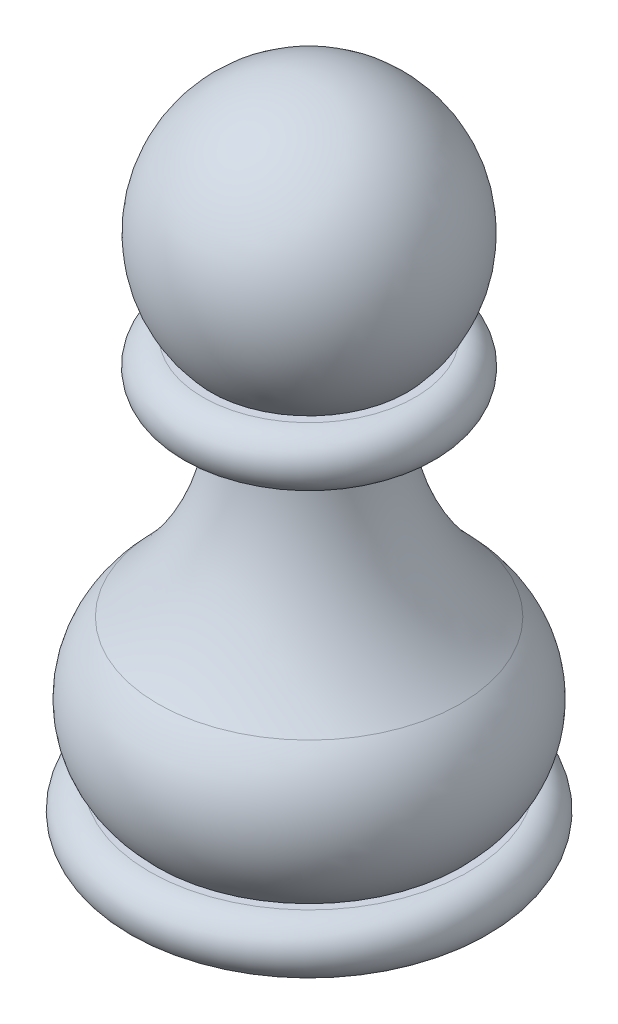
ISO-10303-21;
HEADER;
FILE_DESCRIPTION(('STEP AP214'),'2;1');
FILE_NAME('part.step','',(''),(''),'','','');
FILE_SCHEMA(('AUTOMOTIVE_DESIGN { 1 0 10303 214 1 1 1 1 }'));
ENDSEC;
DATA;
#1=APPLICATION_CONTEXT('core data for automotive mechanical design processes');
#2=APPLICATION_PROTOCOL_DEFINITION('international standard','automotive_design',2000,#1);
#3=PRODUCT_CONTEXT('',#1,'mechanical');
#4=PRODUCT('Part','Part','',(#3));
#5=PRODUCT_RELATED_PRODUCT_CATEGORY('part','',(#4));
#6=PRODUCT_DEFINITION_FORMATION('','',#4);
#7=PRODUCT_DEFINITION_CONTEXT('part definition',#1,'design');
#8=PRODUCT_DEFINITION('design','',#6,#7);
#9=PRODUCT_DEFINITION_SHAPE('','',#8);
#10=(LENGTH_UNIT() NAMED_UNIT(*) SI_UNIT(.MILLI.,.METRE.));
#11=(NAMED_UNIT(*) PLANE_ANGLE_UNIT() SI_UNIT($,.RADIAN.));
#12=(NAMED_UNIT(*) SI_UNIT($,.STERADIAN.) SOLID_ANGLE_UNIT());
#13=UNCERTAINTY_MEASURE_WITH_UNIT(LENGTH_MEASURE(1.E-05),#10,'distance_accuracy_value','');
#14=(GEOMETRIC_REPRESENTATION_CONTEXT(3) GLOBAL_UNCERTAINTY_ASSIGNED_CONTEXT((#13)) GLOBAL_UNIT_ASSIGNED_CONTEXT((#10,
#11,#12)) REPRESENTATION_CONTEXT('',''));
#15=CARTESIAN_POINT('',(0.,0.,0.));
#16=DIRECTION('',(0.,0.,1.));
#17=DIRECTION('',(1.,0.,0.));
#18=AXIS2_PLACEMENT_3D('',#15,#16,#17);
#19=CARTESIAN_POINT('',(0.,-127.184439834025,0.));
#20=DIRECTION('',(0.,-1.,0.));
#21=DIRECTION('',(0.,0.,-1.));
#22=AXIS2_PLACEMENT_3D('',#19,#20,#21);
#23=PLANE('',#22);
#24=CARTESIAN_POINT('',(43.3960580912863,-127.184439834025,0.));
#25=DIRECTION('',(0.,1.,0.));
#26=DIRECTION('',(0.,0.,1.));
#27=AXIS2_PLACEMENT_3D('',#24,#25,#26);
#28=CIRCLE('',#27,229.385689951311);
#29=CARTESIAN_POINT('',(43.3960580912863,-127.184439834025,229.385689951311));
#30=VERTEX_POINT('',#29);
#31=EDGE_CURVE('E11',#30,#30,#28,.T.);
#32=ORIENTED_EDGE('',*,*,#31,.T.);
#33=EDGE_LOOP('',(#32));
#34=FACE_BOUND('',#33,.T.);
#35=ADVANCED_FACE('F52',(#34),#23,.F.);
#36=CARTESIAN_POINT('',(43.3960580912862,-165.284439834025,0.));
#37=DIRECTION('',(0.,1.,0.));
#38=DIRECTION('',(0.,0.,1.));
#39=AXIS2_PLACEMENT_3D('',#36,#37,#38);
#40=TOROIDAL_SURFACE('',#39,229.385689951311,38.1);
#41=CARTESIAN_POINT('',(43.3960580912863,-203.384439834025,0.));
#42=DIRECTION('',(0.,1.,0.));
#43=DIRECTION('',(0.,0.,1.));
#44=AXIS2_PLACEMENT_3D('',#41,#42,#43);
#45=CIRCLE('',#44,229.385689951311);
#46=CARTESIAN_POINT('',(43.3960580912863,-203.384439834025,229.385689951311));
#47=VERTEX_POINT('',#46);
#48=EDGE_CURVE('E58',#47,#47,#45,.T.);
#49=ORIENTED_EDGE('',*,*,#48,.T.);
#50=EDGE_LOOP('',(#49));
#51=FACE_BOUND('',#50,.T.);
#52=ORIENTED_EDGE('',*,*,#31,.F.);
#53=EDGE_LOOP('',(#52));
#54=FACE_BOUND('',#53,.T.);
#55=ADVANCED_FACE('F64',(#51,#54),#40,.T.);
#56=CARTESIAN_POINT('',(0.,-203.384439834025,0.));
#57=DIRECTION('',(0.,-1.,0.));
#58=DIRECTION('',(0.,0.,-1.));
#59=AXIS2_PLACEMENT_3D('',#56,#57,#58);
#60=PLANE('',#59);
#61=ORIENTED_EDGE('',*,*,#48,.F.);
#62=EDGE_LOOP('',(#61));
#63=FACE_BOUND('',#62,.T.);
#64=ADVANCED_FACE('F67',(#63),#60,.T.);
#65=CLOSED_SHELL('',(#35,#55,#64));
#66=MANIFOLD_SOLID_BREP('B2',#65);
#67=CARTESIAN_POINT('',(43.3960580912863,76.0155601659751,0.));
#68=DIRECTION('',(0.,-1.,0.));
#69=DIRECTION('',(0.,0.,-1.));
#70=AXIS2_PLACEMENT_3D('',#67,#68,#69);
#71=CONICAL_SURFACE('',#70,217.474407401017,0.0041964545516721);
#72=CARTESIAN_POINT('',(43.3960580912863,-127.184439834025,0.));
#73=DIRECTION('',(0.,1.,0.));
#74=DIRECTION('',(0.,0.,1.));
#75=AXIS2_PLACEMENT_3D('',#72,#73,#74);
#76=CIRCLE('',#75,218.327131971482);
#77=CARTESIAN_POINT('',(43.3960580912863,-127.184439834025,218.327131971482));
#78=VERTEX_POINT('',#77);
#79=EDGE_CURVE('E112',#78,#78,#76,.T.);
#80=ORIENTED_EDGE('',*,*,#79,.F.);
#81=EDGE_LOOP('',(#80));
#82=FACE_BOUND('',#81,.T.);
#83=CARTESIAN_POINT('',(43.3960580912863,76.0155601659751,0.));
#84=DIRECTION('',(0.,1.,0.));
#85=DIRECTION('',(0.,0.,1.));
#86=AXIS2_PLACEMENT_3D('',#83,#84,#85);
#87=CIRCLE('',#86,217.474407401017);
#88=CARTESIAN_POINT('',(43.3960580912863,76.0155601659751,217.474407401017));
#89=VERTEX_POINT('',#88);
#90=EDGE_CURVE('E51',#89,#89,#87,.T.);
#91=ORIENTED_EDGE('',*,*,#90,.T.);
#92=EDGE_LOOP('',(#91));
#93=FACE_BOUND('',#92,.T.);
#94=ADVANCED_FACE('F106',(#82,#93),#71,.F.);
#95=CARTESIAN_POINT('',(43.3960580912863,-26.0010449192238,0.));
#96=DIRECTION('',(0.,1.,0.));
#97=DIRECTION('',(0.,0.,1.));
#98=AXIS2_PLACEMENT_3D('',#95,#96,#97);
#99=DEGENERATE_TOROIDAL_SURFACE('',#98,118.625861650825,142.050775112413,.T.);
#100=ORIENTED_EDGE('',*,*,#79,.T.);
#101=EDGE_LOOP('',(#100));
#102=FACE_BOUND('',#101,.T.);
#103=ORIENTED_EDGE('',*,*,#90,.F.);
#104=EDGE_LOOP('',(#103));
#105=FACE_BOUND('',#104,.T.);
#106=ADVANCED_FACE('F118',(#102,#105),#99,.T.);
#107=CLOSED_SHELL('',(#94,#106));
#108=MANIFOLD_SOLID_BREP('B6',#107);
#109=CARTESIAN_POINT('',(0.,425.838329958692,0.));
#110=DIRECTION('',(0.,-1.,0.));
#111=DIRECTION('',(0.,0.,-1.));
#112=AXIS2_PLACEMENT_3D('',#109,#110,#111);
#113=PLANE('',#112);
#114=CARTESIAN_POINT('',(43.3960580912863,425.838329958692,0.));
#115=DIRECTION('',(0.,-1.,0.));
#116=DIRECTION('',(0.,0.,-1.));
#117=AXIS2_PLACEMENT_3D('',#114,#115,#116);
#118=CIRCLE('',#117,140.862582645731);
#119=CARTESIAN_POINT('',(43.3960580912863,425.838329958692,-140.862582645731));
#120=VERTEX_POINT('',#119);
#121=EDGE_CURVE('E105',#120,#120,#118,.F.);
#122=ORIENTED_EDGE('',*,*,#121,.F.);
#123=EDGE_LOOP('',(#122));
#124=FACE_BOUND('',#123,.T.);
#125=CARTESIAN_POINT('',(43.3960580912863,425.838329958692,0.));
#126=DIRECTION('',(0.,1.,0.));
#127=DIRECTION('',(0.,0.,1.));
#128=AXIS2_PLACEMENT_3D('',#125,#126,#127);
#129=CIRCLE('',#128,152.811025060079);
#130=CARTESIAN_POINT('',(43.3960580912863,425.838329958692,152.811025060079));
#131=VERTEX_POINT('',#130);
#132=EDGE_CURVE('E150',#131,#131,#129,.T.);
#133=ORIENTED_EDGE('',*,*,#132,.T.);
#134=EDGE_LOOP('',(#133));
#135=FACE_BOUND('',#134,.T.);
#136=ADVANCED_FACE('F142',(#124,#135),#113,.F.);
#137=CARTESIAN_POINT('',(43.3960580912863,387.738329958692,0.));
#138=DIRECTION('',(0.,1.,0.));
#139=DIRECTION('',(0.,0.,1.));
#140=AXIS2_PLACEMENT_3D('',#137,#138,#139);
#141=TOROIDAL_SURFACE('',#140,152.811025060079,38.1);
#142=CARTESIAN_POINT('',(43.3960580912863,349.638329958692,0.));
#143=DIRECTION('',(0.,1.,0.));
#144=DIRECTION('',(0.,0.,1.));
#145=AXIS2_PLACEMENT_3D('',#142,#143,#144);
#146=CIRCLE('',#145,152.811025060079);
#147=CARTESIAN_POINT('',(43.3960580912863,349.638329958692,152.811025060079));
#148=VERTEX_POINT('',#147);
#149=EDGE_CURVE('E155',#148,#148,#146,.T.);
#150=ORIENTED_EDGE('',*,*,#149,.T.);
#151=EDGE_LOOP('',(#150));
#152=FACE_BOUND('',#151,.T.);
#153=ORIENTED_EDGE('',*,*,#132,.F.);
#154=EDGE_LOOP('',(#153));
#155=FACE_BOUND('',#154,.T.);
#156=ADVANCED_FACE('F192',(#152,#155),#141,.T.);
#157=CARTESIAN_POINT('',(1.27011949582504E-13,349.638329958692,0.));
#158=DIRECTION('',(0.,-1.,0.));
#159=DIRECTION('',(0.,0.,-1.));
#160=AXIS2_PLACEMENT_3D('',#157,#158,#159);
#161=PLANE('',#160);
#162=CARTESIAN_POINT('',(43.3960580912863,349.638329958692,0.));
#163=DIRECTION('',(0.,1.,0.));
#164=DIRECTION('',(0.,0.,1.));
#165=AXIS2_PLACEMENT_3D('',#162,#163,#164);
#166=CIRCLE('',#165,101.6);
#167=CARTESIAN_POINT('',(43.3960580912863,349.638329958692,101.6));
#168=VERTEX_POINT('',#167);
#169=EDGE_CURVE('E160',#168,#168,#166,.T.);
#170=ORIENTED_EDGE('',*,*,#169,.T.);
#171=EDGE_LOOP('',(#170));
#172=FACE_BOUND('',#171,.T.);
#173=ORIENTED_EDGE('',*,*,#149,.F.);
#174=EDGE_LOOP('',(#173));
#175=FACE_BOUND('',#174,.T.);
#176=ADVANCED_FACE('F197',(#172,#175),#161,.T.);
#177=CARTESIAN_POINT('',(43.3960580912863,349.638329958692,0.));
#178=DIRECTION('',(0.,1.,0.));
#179=DIRECTION('',(0.,0.,1.));
#180=AXIS2_PLACEMENT_3D('',#177,#178,#179);
#181=TOROIDAL_SURFACE('',#180,482.6,381.);
#182=ORIENTED_EDGE('',*,*,#169,.F.);
#183=EDGE_LOOP('',(#182));
#184=FACE_BOUND('',#183,.T.);
#185=CARTESIAN_POINT('',(43.3960580912863,76.0155601659751,0.));
#186=DIRECTION('',(0.,1.,0.));
#187=DIRECTION('',(0.,0.,1.));
#188=AXIS2_PLACEMENT_3D('',#185,#186,#187);
#189=CIRCLE('',#188,217.474407401017);
#190=CARTESIAN_POINT('',(43.3960580912863,76.0155601659751,217.474407401017));
#191=VERTEX_POINT('',#190);
#192=EDGE_CURVE('E166',#191,#191,#189,.T.);
#193=ORIENTED_EDGE('',*,*,#192,.T.);
#194=EDGE_LOOP('',(#193));
#195=FACE_BOUND('',#194,.T.);
#196=ADVANCED_FACE('F203',(#184,#195),#181,.F.);
#197=CARTESIAN_POINT('',(0.,76.0155601659751,0.));
#198=DIRECTION('',(0.,1.,0.));
#199=DIRECTION('',(0.,0.,1.));
#200=AXIS2_PLACEMENT_3D('',#197,#198,#199);
#201=PLANE('',#200);
#202=ORIENTED_EDGE('',*,*,#192,.F.);
#203=EDGE_LOOP('',(#202));
#204=FACE_BOUND('',#203,.T.);
#205=CARTESIAN_POINT('',(43.3960580912863,76.0155601659751,0.));
#206=DIRECTION('',(0.,1.,0.));
#207=DIRECTION('',(0.,0.,1.));
#208=AXIS2_PLACEMENT_3D('',#205,#206,#207);
#209=CIRCLE('',#208,101.6);
#210=CARTESIAN_POINT('',(43.3960580912863,76.0155601659751,101.6));
#211=VERTEX_POINT('',#210);
#212=EDGE_CURVE('E170',#211,#211,#209,.T.);
#213=ORIENTED_EDGE('',*,*,#212,.T.);
#214=EDGE_LOOP('',(#213));
#215=FACE_BOUND('',#214,.T.);
#216=ADVANCED_FACE('F188',(#204,#215),#201,.F.);
#217=CARTESIAN_POINT('',(43.3960580912863,744.588019277515,0.));
#218=DIRECTION('',(0.,1.,0.));
#219=DIRECTION('',(0.,0.,1.));
#220=AXIS2_PLACEMENT_3D('',#217,#218,#219);
#221=CYLINDRICAL_SURFACE('',#220,101.6);
#222=ORIENTED_EDGE('',*,*,#212,.F.);
#223=EDGE_LOOP('',(#222));
#224=FACE_BOUND('',#223,.T.);
#225=CARTESIAN_POINT('',(43.3960580912863,76.0164604753991,0.));
#226=DIRECTION('',(0.,1.,0.));
#227=DIRECTION('',(0.,0.,1.));
#228=AXIS2_PLACEMENT_3D('',#225,#226,#227);
#229=CIRCLE('',#228,101.6);
#230=CARTESIAN_POINT('',(43.3960580912863,76.0164604753991,101.6));
#231=VERTEX_POINT('',#230);
#232=EDGE_CURVE('E174',#231,#231,#229,.T.);
#233=ORIENTED_EDGE('',*,*,#232,.T.);
#234=EDGE_LOOP('',(#233));
#235=FACE_BOUND('',#234,.T.);
#236=ADVANCED_FACE('F179',(#224,#235),#221,.F.);
#237=CARTESIAN_POINT('',(0.,76.0164604753991,0.));
#238=DIRECTION('',(0.,-1.,0.));
#239=DIRECTION('',(0.,0.,-1.));
#240=AXIS2_PLACEMENT_3D('',#237,#238,#239);
#241=PLANE('',#240);
#242=ORIENTED_EDGE('',*,*,#232,.F.);
#243=EDGE_LOOP('',(#242));
#244=FACE_BOUND('',#243,.T.);
#245=ADVANCED_FACE('F181',(#244),#241,.T.);
#246=CARTESIAN_POINT('',(43.3960580912863,554.088019277515,0.));
#247=DIRECTION('',(0.,1.,0.));
#248=DIRECTION('',(1.,0.,0.));
#249=AXIS2_PLACEMENT_3D('',#246,#247,#248);
#250=SPHERICAL_SURFACE('',#249,190.5);
#251=ORIENTED_EDGE('',*,*,#121,.T.);
#252=EDGE_LOOP('',(#251));
#253=FACE_BOUND('',#252,.T.);
#254=ADVANCED_FACE('F144',(#253),#250,.T.);
#255=CLOSED_SHELL('',(#136,#156,#176,#196,#216,#236,#245,#254));
#256=MANIFOLD_SOLID_BREP('B46',#255);
#257=ADVANCED_BREP_SHAPE_REPRESENTATION('',(#18,#66,#108,#256),#14);
#258=SHAPE_DEFINITION_REPRESENTATION(#9,#257);
ENDSEC;
END-ISO-10303-21;
